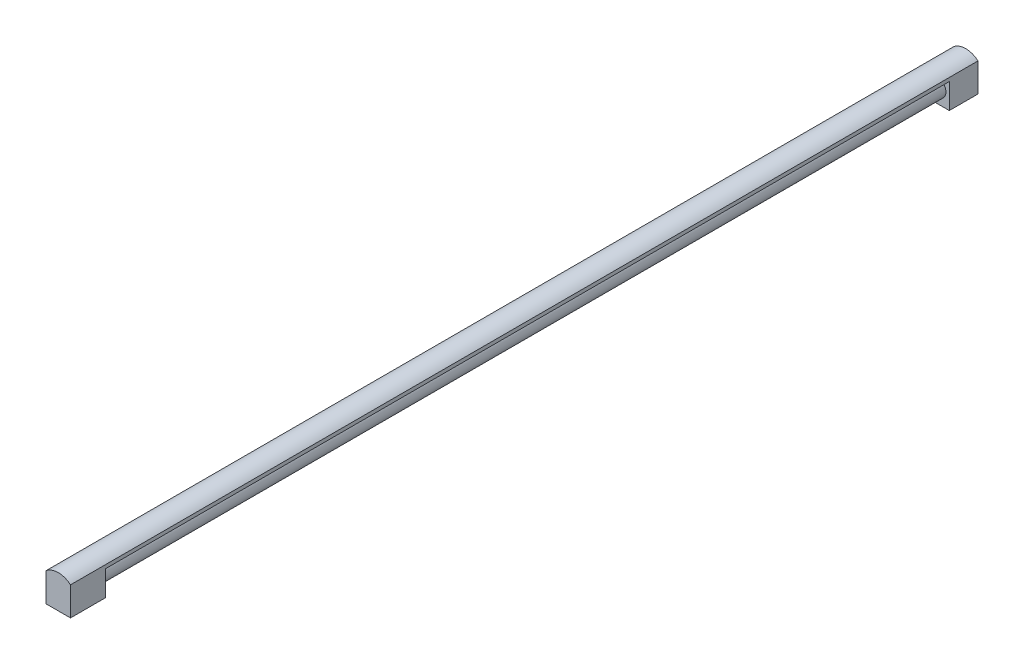
ISO-10303-21;
HEADER;
FILE_DESCRIPTION(('STEP AP214'),'2;1');
FILE_NAME('part.step','',(''),(''),'','','');
FILE_SCHEMA(('AUTOMOTIVE_DESIGN { 1 0 10303 214 1 1 1 1 }'));
ENDSEC;
DATA;
#1=APPLICATION_CONTEXT('core data for automotive mechanical design processes');
#2=APPLICATION_PROTOCOL_DEFINITION('international standard','automotive_design',2000,#1);
#3=PRODUCT_CONTEXT('',#1,'mechanical');
#4=PRODUCT('Part','Part','',(#3));
#5=PRODUCT_RELATED_PRODUCT_CATEGORY('part','',(#4));
#6=PRODUCT_DEFINITION_FORMATION('','',#4);
#7=PRODUCT_DEFINITION_CONTEXT('part definition',#1,'design');
#8=PRODUCT_DEFINITION('design','',#6,#7);
#9=PRODUCT_DEFINITION_SHAPE('','',#8);
#10=(LENGTH_UNIT() NAMED_UNIT(*) SI_UNIT(.MILLI.,.METRE.));
#11=(NAMED_UNIT(*) PLANE_ANGLE_UNIT() SI_UNIT($,.RADIAN.));
#12=(NAMED_UNIT(*) SI_UNIT($,.STERADIAN.) SOLID_ANGLE_UNIT());
#13=UNCERTAINTY_MEASURE_WITH_UNIT(LENGTH_MEASURE(1.E-05),#10,'distance_accuracy_value','');
#14=(GEOMETRIC_REPRESENTATION_CONTEXT(3) GLOBAL_UNCERTAINTY_ASSIGNED_CONTEXT((#13)) GLOBAL_UNIT_ASSIGNED_CONTEXT((#10,
#11,#12)) REPRESENTATION_CONTEXT('',''));
#15=CARTESIAN_POINT('',(0.,0.,0.));
#16=DIRECTION('',(0.,0.,1.));
#17=DIRECTION('',(1.,0.,0.));
#18=AXIS2_PLACEMENT_3D('',#15,#16,#17);
#19=CARTESIAN_POINT('',(0.,0.,0.));
#20=DIRECTION('',(0.,0.,-1.));
#21=DIRECTION('',(-1.,0.,0.));
#22=AXIS2_PLACEMENT_3D('',#19,#20,#21);
#23=PLANE('',#22);
#24=CARTESIAN_POINT('',(0.,0.,0.));
#25=DIRECTION('',(0.,0.,-1.));
#26=DIRECTION('',(-1.,0.,0.));
#27=AXIS2_PLACEMENT_3D('',#24,#25,#26);
#28=CIRCLE('',#27,12.7);
#29=CARTESIAN_POINT('',(-12.7,0.,0.));
#30=VERTEX_POINT('',#29);
#31=EDGE_CURVE('E11',#30,#30,#28,.T.);
#32=ORIENTED_EDGE('',*,*,#31,.F.);
#33=EDGE_LOOP('',(#32));
#34=FACE_BOUND('',#33,.T.);
#35=DIRECTION('',(0.,-1.,0.));
#36=VECTOR('',#35,1.);
#37=CARTESIAN_POINT('',(-17.5,-20.5,0.));
#38=LINE('',#37,#36);
#39=CARTESIAN_POINT('',(-17.5,15.42,0.));
#40=VERTEX_POINT('',#39);
#41=CARTESIAN_POINT('',(-17.5,-20.5,0.));
#42=VERTEX_POINT('',#41);
#43=EDGE_CURVE('E65',#40,#42,#38,.T.);
#44=ORIENTED_EDGE('',*,*,#43,.F.);
#45=DIRECTION('',(-1.,0.,0.));
#46=VECTOR('',#45,1.);
#47=CARTESIAN_POINT('',(0.,15.42,0.));
#48=LINE('',#47,#46);
#49=CARTESIAN_POINT('',(17.5,15.42,0.));
#50=VERTEX_POINT('',#49);
#51=EDGE_CURVE('E124',#50,#40,#48,.T.);
#52=ORIENTED_EDGE('',*,*,#51,.F.);
#53=DIRECTION('',(0.,1.,0.));
#54=VECTOR('',#53,1.);
#55=CARTESIAN_POINT('',(17.5,-20.5,0.));
#56=LINE('',#55,#54);
#57=CARTESIAN_POINT('',(17.5,-20.5,0.));
#58=VERTEX_POINT('',#57);
#59=EDGE_CURVE('E114',#58,#50,#56,.T.);
#60=ORIENTED_EDGE('',*,*,#59,.F.);
#61=DIRECTION('',(1.,0.,0.));
#62=VECTOR('',#61,1.);
#63=CARTESIAN_POINT('',(-17.5,-20.5,0.));
#64=LINE('',#63,#62);
#65=EDGE_CURVE('E111',#42,#58,#64,.T.);
#66=ORIENTED_EDGE('',*,*,#65,.F.);
#67=EDGE_LOOP('',(#44,#52,#60,#66));
#68=FACE_BOUND('',#67,.T.);
#69=ADVANCED_FACE('F35',(#34,#68),#23,.T.);
#70=CARTESIAN_POINT('',(0.,0.,50.));
#71=DIRECTION('',(0.,0.,-1.));
#72=DIRECTION('',(-1.,0.,0.));
#73=AXIS2_PLACEMENT_3D('',#70,#71,#72);
#74=CYLINDRICAL_SURFACE('',#73,26.9536639438871);
#75=DIRECTION('',(0.,0.,-1.));
#76=VECTOR('',#75,1.);
#77=CARTESIAN_POINT('',(17.5,20.5,50.));
#78=LINE('',#77,#76);
#79=CARTESIAN_POINT('',(17.5,20.5,50.));
#80=VERTEX_POINT('',#79);
#81=CARTESIAN_POINT('',(17.5,20.5,-1247.));
#82=VERTEX_POINT('',#81);
#83=EDGE_CURVE('E106',#80,#82,#78,.T.);
#84=ORIENTED_EDGE('',*,*,#83,.T.);
#85=CARTESIAN_POINT('',(0.,0.,-1247.));
#86=DIRECTION('',(0.,0.,-1.));
#87=DIRECTION('',(1.,0.,0.));
#88=AXIS2_PLACEMENT_3D('',#85,#86,#87);
#89=CIRCLE('',#88,26.9536639438871);
#90=CARTESIAN_POINT('',(-17.5,20.5,-1247.));
#91=VERTEX_POINT('',#90);
#92=EDGE_CURVE('E274',#91,#82,#89,.T.);
#93=ORIENTED_EDGE('',*,*,#92,.F.);
#94=DIRECTION('',(0.,0.,-1.));
#95=VECTOR('',#94,1.);
#96=CARTESIAN_POINT('',(-17.5,20.5,50.));
#97=LINE('',#96,#95);
#98=CARTESIAN_POINT('',(-17.5,20.5,50.));
#99=VERTEX_POINT('',#98);
#100=EDGE_CURVE('E39',#99,#91,#97,.T.);
#101=ORIENTED_EDGE('',*,*,#100,.F.);
#102=CARTESIAN_POINT('',(0.,0.,50.));
#103=DIRECTION('',(0.,0.,1.));
#104=DIRECTION('',(-1.,0.,0.));
#105=AXIS2_PLACEMENT_3D('',#102,#103,#104);
#106=CIRCLE('',#105,26.9536639438871);
#107=EDGE_CURVE('E94',#80,#99,#106,.T.);
#108=ORIENTED_EDGE('',*,*,#107,.F.);
#109=EDGE_LOOP('',(#84,#93,#101,#108));
#110=FACE_BOUND('',#109,.T.);
#111=ADVANCED_FACE('F37',(#110),#74,.T.);
#112=CARTESIAN_POINT('',(-17.5,-20.5,50.));
#113=DIRECTION('',(1.,0.,0.));
#114=DIRECTION('',(0.,0.,-1.));
#115=AXIS2_PLACEMENT_3D('',#112,#113,#114);
#116=PLANE('',#115);
#117=ORIENTED_EDGE('',*,*,#100,.T.);
#118=DIRECTION('',(0.,1.,0.));
#119=VECTOR('',#118,1.);
#120=CARTESIAN_POINT('',(-17.5,20.5,-1247.));
#121=LINE('',#120,#119);
#122=CARTESIAN_POINT('',(-17.5,-20.5,-1247.));
#123=VERTEX_POINT('',#122);
#124=EDGE_CURVE('E270',#123,#91,#121,.T.);
#125=ORIENTED_EDGE('',*,*,#124,.F.);
#126=DIRECTION('',(0.,0.,1.));
#127=VECTOR('',#126,1.);
#128=CARTESIAN_POINT('',(-17.5,-20.5,-1247.));
#129=LINE('',#128,#127);
#130=CARTESIAN_POINT('',(-17.5,-20.5,-1206.));
#131=VERTEX_POINT('',#130);
#132=EDGE_CURVE('E130',#123,#131,#129,.T.);
#133=ORIENTED_EDGE('',*,*,#132,.T.);
#134=DIRECTION('',(0.,1.,0.));
#135=VECTOR('',#134,1.);
#136=CARTESIAN_POINT('',(-17.5,20.5,-1206.));
#137=LINE('',#136,#135);
#138=CARTESIAN_POINT('',(-17.5,15.42,-1206.));
#139=VERTEX_POINT('',#138);
#140=EDGE_CURVE('E293',#131,#139,#137,.T.);
#141=ORIENTED_EDGE('',*,*,#140,.T.);
#142=DIRECTION('',(0.,0.,1.));
#143=VECTOR('',#142,1.);
#144=CARTESIAN_POINT('',(-17.5,15.42,-1206.));
#145=LINE('',#144,#143);
#146=EDGE_CURVE('E127',#139,#40,#145,.T.);
#147=ORIENTED_EDGE('',*,*,#146,.T.);
#148=ORIENTED_EDGE('',*,*,#43,.T.);
#149=DIRECTION('',(0.,0.,-1.));
#150=VECTOR('',#149,1.);
#151=CARTESIAN_POINT('',(-17.5,-20.5,50.));
#152=LINE('',#151,#150);
#153=CARTESIAN_POINT('',(-17.5,-20.5,50.));
#154=VERTEX_POINT('',#153);
#155=EDGE_CURVE('E98',#154,#42,#152,.T.);
#156=ORIENTED_EDGE('',*,*,#155,.F.);
#157=DIRECTION('',(0.,-1.,0.));
#158=VECTOR('',#157,1.);
#159=CARTESIAN_POINT('',(-17.5,-20.5,50.));
#160=LINE('',#159,#158);
#161=EDGE_CURVE('E88',#99,#154,#160,.T.);
#162=ORIENTED_EDGE('',*,*,#161,.F.);
#163=EDGE_LOOP('',(#117,#125,#133,#141,#147,#148,#156,#162));
#164=FACE_BOUND('',#163,.T.);
#165=ADVANCED_FACE('F99',(#164),#116,.F.);
#166=CARTESIAN_POINT('',(-17.5,-20.5,50.));
#167=DIRECTION('',(0.,1.,0.));
#168=DIRECTION('',(0.,0.,1.));
#169=AXIS2_PLACEMENT_3D('',#166,#167,#168);
#170=PLANE('',#169);
#171=ORIENTED_EDGE('',*,*,#65,.T.);
#172=DIRECTION('',(0.,0.,-1.));
#173=VECTOR('',#172,1.);
#174=CARTESIAN_POINT('',(17.5,-20.5,50.));
#175=LINE('',#174,#173);
#176=CARTESIAN_POINT('',(17.5,-20.5,50.));
#177=VERTEX_POINT('',#176);
#178=EDGE_CURVE('E102',#177,#58,#175,.T.);
#179=ORIENTED_EDGE('',*,*,#178,.F.);
#180=DIRECTION('',(1.,0.,0.));
#181=VECTOR('',#180,1.);
#182=CARTESIAN_POINT('',(-17.5,-20.5,50.));
#183=LINE('',#182,#181);
#184=EDGE_CURVE('E91',#154,#177,#183,.T.);
#185=ORIENTED_EDGE('',*,*,#184,.F.);
#186=ORIENTED_EDGE('',*,*,#155,.T.);
#187=EDGE_LOOP('',(#171,#179,#185,#186));
#188=FACE_BOUND('',#187,.T.);
#189=ADVANCED_FACE('F103',(#188),#170,.F.);
#190=CARTESIAN_POINT('',(17.5,-20.5,50.));
#191=DIRECTION('',(-1.,0.,0.));
#192=DIRECTION('',(0.,0.,1.));
#193=AXIS2_PLACEMENT_3D('',#190,#191,#192);
#194=PLANE('',#193);
#195=ORIENTED_EDGE('',*,*,#59,.T.);
#196=DIRECTION('',(0.,0.,1.));
#197=VECTOR('',#196,1.);
#198=CARTESIAN_POINT('',(17.5,15.42,-1206.));
#199=LINE('',#198,#197);
#200=CARTESIAN_POINT('',(17.5,15.42,-1206.));
#201=VERTEX_POINT('',#200);
#202=EDGE_CURVE('E134',#201,#50,#199,.T.);
#203=ORIENTED_EDGE('',*,*,#202,.F.);
#204=DIRECTION('',(0.,-1.,0.));
#205=VECTOR('',#204,1.);
#206=CARTESIAN_POINT('',(17.5,20.5,-1206.));
#207=LINE('',#206,#205);
#208=CARTESIAN_POINT('',(17.5,-20.5,-1206.));
#209=VERTEX_POINT('',#208);
#210=EDGE_CURVE('E288',#201,#209,#207,.T.);
#211=ORIENTED_EDGE('',*,*,#210,.T.);
#212=DIRECTION('',(0.,0.,1.));
#213=VECTOR('',#212,1.);
#214=CARTESIAN_POINT('',(17.5,-20.5,-1247.));
#215=LINE('',#214,#213);
#216=CARTESIAN_POINT('',(17.5,-20.5,-1247.));
#217=VERTEX_POINT('',#216);
#218=EDGE_CURVE('E125',#217,#209,#215,.T.);
#219=ORIENTED_EDGE('',*,*,#218,.F.);
#220=DIRECTION('',(0.,-1.,0.));
#221=VECTOR('',#220,1.);
#222=CARTESIAN_POINT('',(17.5,20.5,-1247.));
#223=LINE('',#222,#221);
#224=EDGE_CURVE('E285',#82,#217,#223,.T.);
#225=ORIENTED_EDGE('',*,*,#224,.F.);
#226=ORIENTED_EDGE('',*,*,#83,.F.);
#227=DIRECTION('',(0.,1.,0.));
#228=VECTOR('',#227,1.);
#229=CARTESIAN_POINT('',(17.5,-20.5,50.));
#230=LINE('',#229,#228);
#231=EDGE_CURVE('E53',#177,#80,#230,.T.);
#232=ORIENTED_EDGE('',*,*,#231,.F.);
#233=ORIENTED_EDGE('',*,*,#178,.T.);
#234=EDGE_LOOP('',(#195,#203,#211,#219,#225,#226,#232,#233));
#235=FACE_BOUND('',#234,.T.);
#236=ADVANCED_FACE('F121',(#235),#194,.F.);
#237=CARTESIAN_POINT('',(0.,0.,50.));
#238=DIRECTION('',(0.,0.,-1.));
#239=DIRECTION('',(-1.,0.,0.));
#240=AXIS2_PLACEMENT_3D('',#237,#238,#239);
#241=PLANE('',#240);
#242=ORIENTED_EDGE('',*,*,#107,.T.);
#243=ORIENTED_EDGE('',*,*,#161,.T.);
#244=ORIENTED_EDGE('',*,*,#184,.T.);
#245=ORIENTED_EDGE('',*,*,#231,.T.);
#246=EDGE_LOOP('',(#242,#243,#244,#245));
#247=FACE_BOUND('',#246,.T.);
#248=ADVANCED_FACE('F89',(#247),#241,.F.);
#249=CARTESIAN_POINT('',(0.,0.,-1206.));
#250=DIRECTION('',(0.,0.,1.));
#251=DIRECTION('',(1.,0.,0.));
#252=AXIS2_PLACEMENT_3D('',#249,#250,#251);
#253=CYLINDRICAL_SURFACE('',#252,12.7);
#254=CARTESIAN_POINT('',(0.,0.,-1206.));
#255=DIRECTION('',(0.,0.,-1.));
#256=DIRECTION('',(-1.,0.,0.));
#257=AXIS2_PLACEMENT_3D('',#254,#255,#256);
#258=CIRCLE('',#257,12.7);
#259=CARTESIAN_POINT('',(-12.7,0.,-1206.));
#260=VERTEX_POINT('',#259);
#261=EDGE_CURVE('E112',#260,#260,#258,.T.);
#262=ORIENTED_EDGE('',*,*,#261,.F.);
#263=EDGE_LOOP('',(#262));
#264=FACE_BOUND('',#263,.T.);
#265=ORIENTED_EDGE('',*,*,#31,.T.);
#266=EDGE_LOOP('',(#265));
#267=FACE_BOUND('',#266,.T.);
#268=ADVANCED_FACE('F142',(#264,#267),#253,.T.);
#269=CARTESIAN_POINT('',(0.,15.42,-1206.));
#270=DIRECTION('',(0.,1.,0.));
#271=DIRECTION('',(0.,0.,1.));
#272=AXIS2_PLACEMENT_3D('',#269,#270,#271);
#273=PLANE('',#272);
#274=ORIENTED_EDGE('',*,*,#51,.T.);
#275=ORIENTED_EDGE('',*,*,#146,.F.);
#276=DIRECTION('',(-1.,0.,0.));
#277=VECTOR('',#276,1.);
#278=CARTESIAN_POINT('',(0.,15.42,-1206.));
#279=LINE('',#278,#277);
#280=EDGE_CURVE('E76',#201,#139,#279,.T.);
#281=ORIENTED_EDGE('',*,*,#280,.F.);
#282=ORIENTED_EDGE('',*,*,#202,.T.);
#283=EDGE_LOOP('',(#274,#275,#281,#282));
#284=FACE_BOUND('',#283,.T.);
#285=ADVANCED_FACE('F145',(#284),#273,.F.);
#286=CARTESIAN_POINT('',(17.5,-20.5,-1247.));
#287=DIRECTION('',(0.,1.,0.));
#288=DIRECTION('',(0.,0.,1.));
#289=AXIS2_PLACEMENT_3D('',#286,#287,#288);
#290=PLANE('',#289);
#291=DIRECTION('',(-1.,0.,0.));
#292=VECTOR('',#291,1.);
#293=CARTESIAN_POINT('',(17.5,-20.5,-1206.));
#294=LINE('',#293,#292);
#295=EDGE_CURVE('E283',#209,#131,#294,.T.);
#296=ORIENTED_EDGE('',*,*,#295,.T.);
#297=ORIENTED_EDGE('',*,*,#132,.F.);
#298=DIRECTION('',(-1.,0.,0.));
#299=VECTOR('',#298,1.);
#300=CARTESIAN_POINT('',(17.5,-20.5,-1247.));
#301=LINE('',#300,#299);
#302=EDGE_CURVE('E278',#217,#123,#301,.T.);
#303=ORIENTED_EDGE('',*,*,#302,.F.);
#304=ORIENTED_EDGE('',*,*,#218,.T.);
#305=EDGE_LOOP('',(#296,#297,#303,#304));
#306=FACE_BOUND('',#305,.T.);
#307=ADVANCED_FACE('F188',(#306),#290,.F.);
#308=CARTESIAN_POINT('',(0.,0.,-1247.));
#309=DIRECTION('',(0.,0.,1.));
#310=DIRECTION('',(1.,0.,0.));
#311=AXIS2_PLACEMENT_3D('',#308,#309,#310);
#312=PLANE('',#311);
#313=ORIENTED_EDGE('',*,*,#124,.T.);
#314=ORIENTED_EDGE('',*,*,#92,.T.);
#315=ORIENTED_EDGE('',*,*,#224,.T.);
#316=ORIENTED_EDGE('',*,*,#302,.T.);
#317=EDGE_LOOP('',(#313,#314,#315,#316));
#318=FACE_BOUND('',#317,.T.);
#319=ADVANCED_FACE('F195',(#318),#312,.F.);
#320=CARTESIAN_POINT('',(0.,0.,-1206.));
#321=DIRECTION('',(0.,0.,1.));
#322=DIRECTION('',(1.,0.,0.));
#323=AXIS2_PLACEMENT_3D('',#320,#321,#322);
#324=PLANE('',#323);
#325=ORIENTED_EDGE('',*,*,#261,.T.);
#326=EDGE_LOOP('',(#325));
#327=FACE_BOUND('',#326,.T.);
#328=ORIENTED_EDGE('',*,*,#210,.F.);
#329=ORIENTED_EDGE('',*,*,#280,.T.);
#330=ORIENTED_EDGE('',*,*,#140,.F.);
#331=ORIENTED_EDGE('',*,*,#295,.F.);
#332=EDGE_LOOP('',(#328,#329,#330,#331));
#333=FACE_BOUND('',#332,.T.);
#334=ADVANCED_FACE('F139',(#327,#333),#324,.T.);
#335=CLOSED_SHELL('',(#69,#111,#165,#189,#236,#248,#268,#285,#307,#319,#334));
#336=MANIFOLD_SOLID_BREP('B2',#335);
#337=ADVANCED_BREP_SHAPE_REPRESENTATION('',(#18,#336),#14);
#338=SHAPE_DEFINITION_REPRESENTATION(#9,#337);
ENDSEC;
END-ISO-10303-21;
